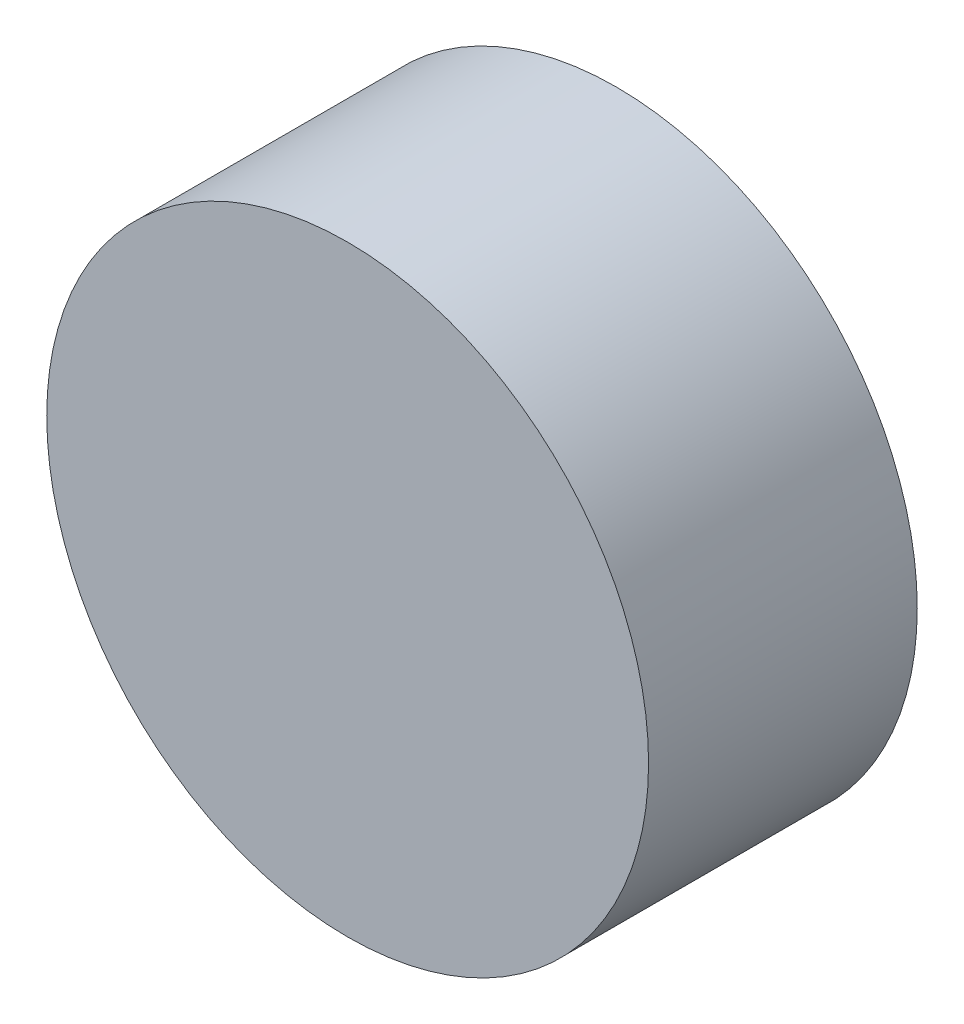
ISO-10303-21;
HEADER;
FILE_DESCRIPTION(('STEP AP214'),'2;1');
FILE_NAME('part.step','',(''),(''),'','','');
FILE_SCHEMA(('AUTOMOTIVE_DESIGN { 1 0 10303 214 1 1 1 1 }'));
ENDSEC;
DATA;
#1=APPLICATION_CONTEXT('core data for automotive mechanical design processes');
#2=APPLICATION_PROTOCOL_DEFINITION('international standard','automotive_design',2000,#1);
#3=PRODUCT_CONTEXT('',#1,'mechanical');
#4=PRODUCT('Part','Part','',(#3));
#5=PRODUCT_RELATED_PRODUCT_CATEGORY('part','',(#4));
#6=PRODUCT_DEFINITION_FORMATION('','',#4);
#7=PRODUCT_DEFINITION_CONTEXT('part definition',#1,'design');
#8=PRODUCT_DEFINITION('design','',#6,#7);
#9=PRODUCT_DEFINITION_SHAPE('','',#8);
#10=(LENGTH_UNIT() NAMED_UNIT(*) SI_UNIT(.MILLI.,.METRE.));
#11=(NAMED_UNIT(*) PLANE_ANGLE_UNIT() SI_UNIT($,.RADIAN.));
#12=(NAMED_UNIT(*) SI_UNIT($,.STERADIAN.) SOLID_ANGLE_UNIT());
#13=UNCERTAINTY_MEASURE_WITH_UNIT(LENGTH_MEASURE(1.E-05),#10,'distance_accuracy_value','');
#14=(GEOMETRIC_REPRESENTATION_CONTEXT(3) GLOBAL_UNCERTAINTY_ASSIGNED_CONTEXT((#13)) GLOBAL_UNIT_ASSIGNED_CONTEXT((#10,
#11,#12)) REPRESENTATION_CONTEXT('',''));
#15=CARTESIAN_POINT('',(0.,0.,0.));
#16=DIRECTION('',(0.,0.,1.));
#17=DIRECTION('',(1.,0.,0.));
#18=AXIS2_PLACEMENT_3D('',#15,#16,#17);
#19=CARTESIAN_POINT('',(0.,0.,10.));
#20=DIRECTION('',(0.,0.,-1.));
#21=DIRECTION('',(-1.,0.,0.));
#22=AXIS2_PLACEMENT_3D('',#19,#20,#21);
#23=CYLINDRICAL_SURFACE('',#22,11.2);
#24=CARTESIAN_POINT('',(0.,0.,10.));
#25=DIRECTION('',(0.,0.,1.));
#26=DIRECTION('',(1.,0.,0.));
#27=AXIS2_PLACEMENT_3D('',#24,#25,#26);
#28=CIRCLE('',#27,11.2);
#29=CARTESIAN_POINT('',(11.2,0.,10.));
#30=VERTEX_POINT('',#29);
#31=EDGE_CURVE('E10',#30,#30,#28,.T.);
#32=ORIENTED_EDGE('',*,*,#31,.F.);
#33=EDGE_LOOP('',(#32));
#34=FACE_BOUND('',#33,.T.);
#35=CARTESIAN_POINT('',(0.,0.,0.));
#36=DIRECTION('',(0.,0.,1.));
#37=DIRECTION('',(1.,0.,0.));
#38=AXIS2_PLACEMENT_3D('',#35,#36,#37);
#39=CIRCLE('',#38,11.2);
#40=CARTESIAN_POINT('',(11.2,0.,0.));
#41=VERTEX_POINT('',#40);
#42=EDGE_CURVE('E40',#41,#41,#39,.T.);
#43=ORIENTED_EDGE('',*,*,#42,.T.);
#44=EDGE_LOOP('',(#43));
#45=FACE_BOUND('',#44,.T.);
#46=ADVANCED_FACE('F37',(#34,#45),#23,.T.);
#47=CARTESIAN_POINT('',(0.,0.,10.));
#48=DIRECTION('',(0.,0.,1.));
#49=DIRECTION('',(1.,0.,0.));
#50=AXIS2_PLACEMENT_3D('',#47,#48,#49);
#51=PLANE('',#50);
#52=ORIENTED_EDGE('',*,*,#31,.T.);
#53=EDGE_LOOP('',(#52));
#54=FACE_BOUND('',#53,.T.);
#55=ADVANCED_FACE('F52',(#54),#51,.T.);
#56=CARTESIAN_POINT('',(0.,0.,0.));
#57=DIRECTION('',(0.,0.,1.));
#58=DIRECTION('',(1.,0.,0.));
#59=AXIS2_PLACEMENT_3D('',#56,#57,#58);
#60=PLANE('',#59);
#61=ORIENTED_EDGE('',*,*,#42,.F.);
#62=EDGE_LOOP('',(#61));
#63=FACE_BOUND('',#62,.T.);
#64=ADVANCED_FACE('F50',(#63),#60,.F.);
#65=CLOSED_SHELL('',(#46,#55,#64));
#66=MANIFOLD_SOLID_BREP('B2',#65);
#67=ADVANCED_BREP_SHAPE_REPRESENTATION('',(#18,#66),#14);
#68=SHAPE_DEFINITION_REPRESENTATION(#9,#67);
ENDSEC;
END-ISO-10303-21;
